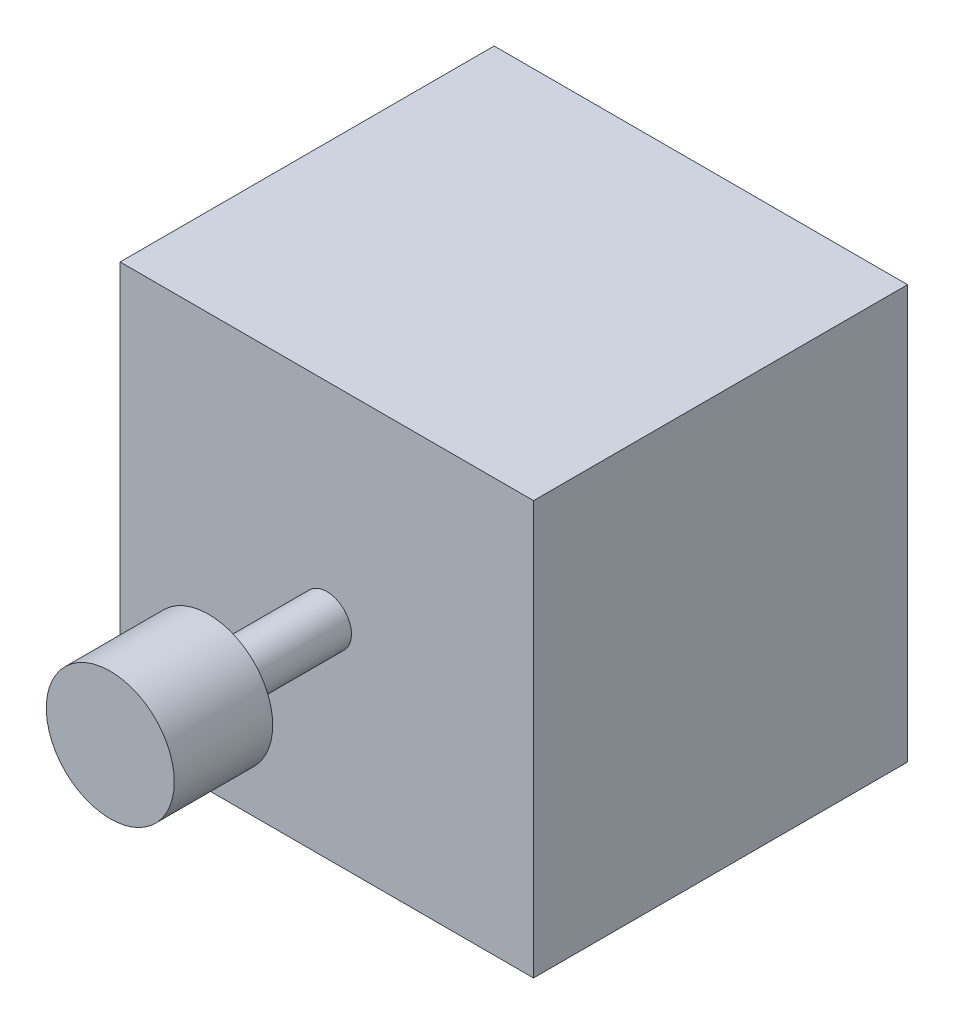
ISO-10303-21;
HEADER;
FILE_DESCRIPTION(('STEP AP214'),'2;1');
FILE_NAME('part.step','',(''),(''),'','','');
FILE_SCHEMA(('AUTOMOTIVE_DESIGN { 1 0 10303 214 1 1 1 1 }'));
ENDSEC;
DATA;
#1=APPLICATION_CONTEXT('core data for automotive mechanical design processes');
#2=APPLICATION_PROTOCOL_DEFINITION('international standard','automotive_design',2000,#1);
#3=PRODUCT_CONTEXT('',#1,'mechanical');
#4=PRODUCT('Part','Part','',(#3));
#5=PRODUCT_RELATED_PRODUCT_CATEGORY('part','',(#4));
#6=PRODUCT_DEFINITION_FORMATION('','',#4);
#7=PRODUCT_DEFINITION_CONTEXT('part definition',#1,'design');
#8=PRODUCT_DEFINITION('design','',#6,#7);
#9=PRODUCT_DEFINITION_SHAPE('','',#8);
#10=(LENGTH_UNIT() NAMED_UNIT(*) SI_UNIT(.MILLI.,.METRE.));
#11=(NAMED_UNIT(*) PLANE_ANGLE_UNIT() SI_UNIT($,.RADIAN.));
#12=(NAMED_UNIT(*) SI_UNIT($,.STERADIAN.) SOLID_ANGLE_UNIT());
#13=UNCERTAINTY_MEASURE_WITH_UNIT(LENGTH_MEASURE(1.E-05),#10,'distance_accuracy_value','');
#14=(GEOMETRIC_REPRESENTATION_CONTEXT(3) GLOBAL_UNCERTAINTY_ASSIGNED_CONTEXT((#13)) GLOBAL_UNIT_ASSIGNED_CONTEXT((#10,
#11,#12)) REPRESENTATION_CONTEXT('',''));
#15=CARTESIAN_POINT('',(0.,0.,0.));
#16=DIRECTION('',(0.,0.,1.));
#17=DIRECTION('',(1.,0.,0.));
#18=AXIS2_PLACEMENT_3D('',#15,#16,#17);
#19=CARTESIAN_POINT('',(0.,0.,60.));
#20=DIRECTION('',(0.,0.,-1.));
#21=DIRECTION('',(-1.,0.,0.));
#22=AXIS2_PLACEMENT_3D('',#19,#20,#21);
#23=CYLINDRICAL_SURFACE('',#22,2.5);
#24=CARTESIAN_POINT('',(0.,0.,38.));
#25=DIRECTION('',(0.,0.,1.));
#26=DIRECTION('',(1.,0.,0.));
#27=AXIS2_PLACEMENT_3D('',#24,#25,#26);
#28=CIRCLE('',#27,2.5);
#29=CARTESIAN_POINT('',(2.5,0.,38.));
#30=VERTEX_POINT('',#29);
#31=EDGE_CURVE('E103',#30,#30,#28,.T.);
#32=ORIENTED_EDGE('',*,*,#31,.T.);
#33=EDGE_LOOP('',(#32));
#34=FACE_BOUND('',#33,.T.);
#35=CARTESIAN_POINT('',(0.,0.,50.));
#36=DIRECTION('',(0.,0.,1.));
#37=DIRECTION('',(1.,0.,0.));
#38=AXIS2_PLACEMENT_3D('',#35,#36,#37);
#39=CIRCLE('',#38,2.5);
#40=CARTESIAN_POINT('',(2.5,0.,50.));
#41=VERTEX_POINT('',#40);
#42=EDGE_CURVE('E11',#41,#41,#39,.T.);
#43=ORIENTED_EDGE('',*,*,#42,.F.);
#44=EDGE_LOOP('',(#43));
#45=FACE_BOUND('',#44,.T.);
#46=ADVANCED_FACE('F32',(#34,#45),#23,.T.);
#47=CARTESIAN_POINT('',(0.,0.,38.));
#48=DIRECTION('',(0.,0.,1.));
#49=DIRECTION('',(1.,0.,0.));
#50=AXIS2_PLACEMENT_3D('',#47,#48,#49);
#51=PLANE('',#50);
#52=DIRECTION('',(0.,1.,0.));
#53=VECTOR('',#52,1.);
#54=CARTESIAN_POINT('',(21.,21.,38.));
#55=LINE('',#54,#53);
#56=CARTESIAN_POINT('',(21.,-21.,38.));
#57=VERTEX_POINT('',#56);
#58=CARTESIAN_POINT('',(21.,21.,38.));
#59=VERTEX_POINT('',#58);
#60=EDGE_CURVE('E86',#57,#59,#55,.T.);
#61=ORIENTED_EDGE('',*,*,#60,.T.);
#62=DIRECTION('',(-1.,0.,0.));
#63=VECTOR('',#62,1.);
#64=CARTESIAN_POINT('',(-21.,21.,38.));
#65=LINE('',#64,#63);
#66=CARTESIAN_POINT('',(-21.,21.,38.));
#67=VERTEX_POINT('',#66);
#68=EDGE_CURVE('E80',#59,#67,#65,.T.);
#69=ORIENTED_EDGE('',*,*,#68,.T.);
#70=DIRECTION('',(0.,-1.,0.));
#71=VECTOR('',#70,1.);
#72=CARTESIAN_POINT('',(-21.,21.,38.));
#73=LINE('',#72,#71);
#74=CARTESIAN_POINT('',(-21.,-21.,38.));
#75=VERTEX_POINT('',#74);
#76=EDGE_CURVE('E84',#67,#75,#73,.T.);
#77=ORIENTED_EDGE('',*,*,#76,.T.);
#78=DIRECTION('',(1.,0.,0.));
#79=VECTOR('',#78,1.);
#80=CARTESIAN_POINT('',(-21.,-21.,38.));
#81=LINE('',#80,#79);
#82=EDGE_CURVE('E49',#75,#57,#81,.T.);
#83=ORIENTED_EDGE('',*,*,#82,.T.);
#84=EDGE_LOOP('',(#61,#69,#77,#83));
#85=FACE_BOUND('',#84,.T.);
#86=ORIENTED_EDGE('',*,*,#31,.F.);
#87=EDGE_LOOP('',(#86));
#88=FACE_BOUND('',#87,.T.);
#89=ADVANCED_FACE('F81',(#85,#88),#51,.T.);
#90=CARTESIAN_POINT('',(21.,21.,38.));
#91=DIRECTION('',(-1.,0.,0.));
#92=DIRECTION('',(0.,0.,1.));
#93=AXIS2_PLACEMENT_3D('',#90,#91,#92);
#94=PLANE('',#93);
#95=DIRECTION('',(0.,1.,0.));
#96=VECTOR('',#95,1.);
#97=CARTESIAN_POINT('',(21.,21.,0.));
#98=LINE('',#97,#96);
#99=CARTESIAN_POINT('',(21.,-21.,0.));
#100=VERTEX_POINT('',#99);
#101=CARTESIAN_POINT('',(21.,21.,0.));
#102=VERTEX_POINT('',#101);
#103=EDGE_CURVE('E100',#100,#102,#98,.T.);
#104=ORIENTED_EDGE('',*,*,#103,.T.);
#105=DIRECTION('',(0.,0.,-1.));
#106=VECTOR('',#105,1.);
#107=CARTESIAN_POINT('',(21.,21.,38.));
#108=LINE('',#107,#106);
#109=EDGE_CURVE('E41',#59,#102,#108,.T.);
#110=ORIENTED_EDGE('',*,*,#109,.F.);
#111=ORIENTED_EDGE('',*,*,#60,.F.);
#112=DIRECTION('',(0.,0.,-1.));
#113=VECTOR('',#112,1.);
#114=CARTESIAN_POINT('',(21.,-21.,38.));
#115=LINE('',#114,#113);
#116=EDGE_CURVE('E96',#57,#100,#115,.T.);
#117=ORIENTED_EDGE('',*,*,#116,.T.);
#118=EDGE_LOOP('',(#104,#110,#111,#117));
#119=FACE_BOUND('',#118,.T.);
#120=ADVANCED_FACE('F34',(#119),#94,.F.);
#121=CARTESIAN_POINT('',(-21.,21.,38.));
#122=DIRECTION('',(0.,-1.,0.));
#123=DIRECTION('',(0.,0.,-1.));
#124=AXIS2_PLACEMENT_3D('',#121,#122,#123);
#125=PLANE('',#124);
#126=DIRECTION('',(-1.,0.,0.));
#127=VECTOR('',#126,1.);
#128=CARTESIAN_POINT('',(-21.,21.,0.));
#129=LINE('',#128,#127);
#130=CARTESIAN_POINT('',(-21.,21.,0.));
#131=VERTEX_POINT('',#130);
#132=EDGE_CURVE('E91',#102,#131,#129,.T.);
#133=ORIENTED_EDGE('',*,*,#132,.T.);
#134=DIRECTION('',(0.,0.,-1.));
#135=VECTOR('',#134,1.);
#136=CARTESIAN_POINT('',(-21.,21.,38.));
#137=LINE('',#136,#135);
#138=EDGE_CURVE('E89',#67,#131,#137,.T.);
#139=ORIENTED_EDGE('',*,*,#138,.F.);
#140=ORIENTED_EDGE('',*,*,#68,.F.);
#141=ORIENTED_EDGE('',*,*,#109,.T.);
#142=EDGE_LOOP('',(#133,#139,#140,#141));
#143=FACE_BOUND('',#142,.T.);
#144=ADVANCED_FACE('F90',(#143),#125,.F.);
#145=CARTESIAN_POINT('',(-21.,21.,38.));
#146=DIRECTION('',(1.,0.,0.));
#147=DIRECTION('',(0.,0.,-1.));
#148=AXIS2_PLACEMENT_3D('',#145,#146,#147);
#149=PLANE('',#148);
#150=DIRECTION('',(0.,-1.,0.));
#151=VECTOR('',#150,1.);
#152=CARTESIAN_POINT('',(-21.,21.,0.));
#153=LINE('',#152,#151);
#154=CARTESIAN_POINT('',(-21.,-21.,0.));
#155=VERTEX_POINT('',#154);
#156=EDGE_CURVE('E66',#131,#155,#153,.T.);
#157=ORIENTED_EDGE('',*,*,#156,.T.);
#158=DIRECTION('',(0.,0.,-1.));
#159=VECTOR('',#158,1.);
#160=CARTESIAN_POINT('',(-21.,-21.,38.));
#161=LINE('',#160,#159);
#162=EDGE_CURVE('E92',#75,#155,#161,.T.);
#163=ORIENTED_EDGE('',*,*,#162,.F.);
#164=ORIENTED_EDGE('',*,*,#76,.F.);
#165=ORIENTED_EDGE('',*,*,#138,.T.);
#166=EDGE_LOOP('',(#157,#163,#164,#165));
#167=FACE_BOUND('',#166,.T.);
#168=ADVANCED_FACE('F94',(#167),#149,.F.);
#169=CARTESIAN_POINT('',(-21.,-21.,38.));
#170=DIRECTION('',(0.,1.,0.));
#171=DIRECTION('',(0.,0.,1.));
#172=AXIS2_PLACEMENT_3D('',#169,#170,#171);
#173=PLANE('',#172);
#174=DIRECTION('',(1.,0.,0.));
#175=VECTOR('',#174,1.);
#176=CARTESIAN_POINT('',(-21.,-21.,0.));
#177=LINE('',#176,#175);
#178=EDGE_CURVE('E72',#155,#100,#177,.T.);
#179=ORIENTED_EDGE('',*,*,#178,.T.);
#180=ORIENTED_EDGE('',*,*,#116,.F.);
#181=ORIENTED_EDGE('',*,*,#82,.F.);
#182=ORIENTED_EDGE('',*,*,#162,.T.);
#183=EDGE_LOOP('',(#179,#180,#181,#182));
#184=FACE_BOUND('',#183,.T.);
#185=ADVANCED_FACE('F114',(#184),#173,.F.);
#186=CARTESIAN_POINT('',(0.,0.,0.));
#187=DIRECTION('',(0.,0.,1.));
#188=DIRECTION('',(1.,0.,0.));
#189=AXIS2_PLACEMENT_3D('',#186,#187,#188);
#190=PLANE('',#189);
#191=ORIENTED_EDGE('',*,*,#103,.F.);
#192=ORIENTED_EDGE('',*,*,#178,.F.);
#193=ORIENTED_EDGE('',*,*,#156,.F.);
#194=ORIENTED_EDGE('',*,*,#132,.F.);
#195=EDGE_LOOP('',(#191,#192,#193,#194));
#196=FACE_BOUND('',#195,.T.);
#197=ADVANCED_FACE('F111',(#196),#190,.F.);
#198=CARTESIAN_POINT('',(0.,0.,50.));
#199=DIRECTION('',(0.,0.,1.));
#200=DIRECTION('',(1.,0.,0.));
#201=AXIS2_PLACEMENT_3D('',#198,#199,#200);
#202=PLANE('',#201);
#203=CARTESIAN_POINT('',(0.,0.,50.));
#204=DIRECTION('',(0.,0.,1.));
#205=DIRECTION('',(1.,0.,0.));
#206=AXIS2_PLACEMENT_3D('',#203,#204,#205);
#207=CIRCLE('',#206,6.5);
#208=CARTESIAN_POINT('',(6.5,0.,50.));
#209=VERTEX_POINT('',#208);
#210=EDGE_CURVE('E145',#209,#209,#207,.T.);
#211=ORIENTED_EDGE('',*,*,#210,.F.);
#212=EDGE_LOOP('',(#211));
#213=FACE_BOUND('',#212,.T.);
#214=ORIENTED_EDGE('',*,*,#42,.T.);
#215=EDGE_LOOP('',(#214));
#216=FACE_BOUND('',#215,.T.);
#217=ADVANCED_FACE('F113',(#213,#216),#202,.F.);
#218=CARTESIAN_POINT('',(0.,0.,50.));
#219=DIRECTION('',(0.,0.,1.));
#220=DIRECTION('',(1.,0.,0.));
#221=AXIS2_PLACEMENT_3D('',#218,#219,#220);
#222=CYLINDRICAL_SURFACE('',#221,6.5);
#223=ORIENTED_EDGE('',*,*,#210,.T.);
#224=EDGE_LOOP('',(#223));
#225=FACE_BOUND('',#224,.T.);
#226=CARTESIAN_POINT('',(0.,0.,60.));
#227=DIRECTION('',(0.,0.,1.));
#228=DIRECTION('',(1.,0.,0.));
#229=AXIS2_PLACEMENT_3D('',#226,#227,#228);
#230=CIRCLE('',#229,6.5);
#231=CARTESIAN_POINT('',(6.5,0.,60.));
#232=VERTEX_POINT('',#231);
#233=EDGE_CURVE('E148',#232,#232,#230,.T.);
#234=ORIENTED_EDGE('',*,*,#233,.F.);
#235=EDGE_LOOP('',(#234));
#236=FACE_BOUND('',#235,.T.);
#237=ADVANCED_FACE('F120',(#225,#236),#222,.T.);
#238=CARTESIAN_POINT('',(0.,0.,60.));
#239=DIRECTION('',(0.,0.,1.));
#240=DIRECTION('',(1.,0.,0.));
#241=AXIS2_PLACEMENT_3D('',#238,#239,#240);
#242=PLANE('',#241);
#243=ORIENTED_EDGE('',*,*,#233,.T.);
#244=EDGE_LOOP('',(#243));
#245=FACE_BOUND('',#244,.T.);
#246=ADVANCED_FACE('F134',(#245),#242,.T.);
#247=CLOSED_SHELL('',(#46,#89,#120,#144,#168,#185,#197,#217,#237,#246));
#248=MANIFOLD_SOLID_BREP('B2',#247);
#249=ADVANCED_BREP_SHAPE_REPRESENTATION('',(#18,#248),#14);
#250=SHAPE_DEFINITION_REPRESENTATION(#9,#249);
ENDSEC;
END-ISO-10303-21;
